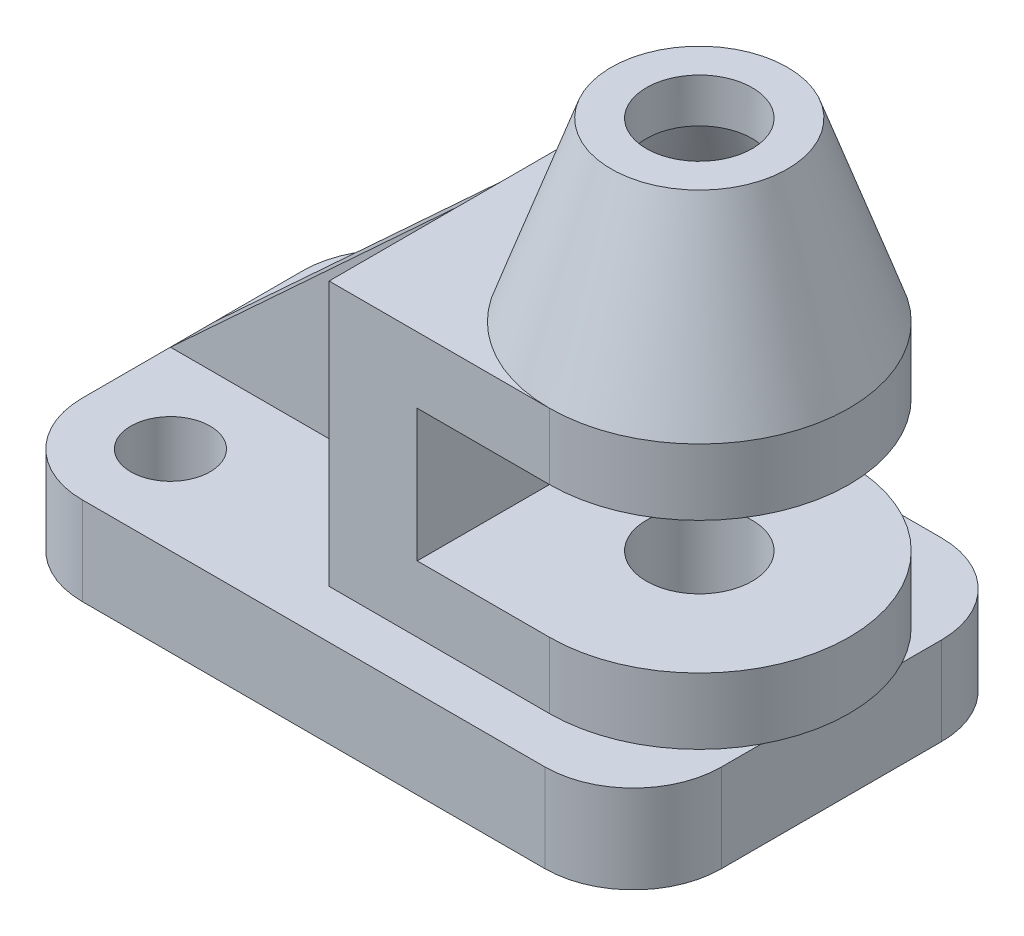
ISO-10303-21;
HEADER;
FILE_DESCRIPTION(('STEP AP214'),'2;1');
FILE_NAME('part.step','',(''),(''),'','','');
FILE_SCHEMA(('AUTOMOTIVE_DESIGN { 1 0 10303 214 1 1 1 1 }'));
ENDSEC;
DATA;
#1=APPLICATION_CONTEXT('core data for automotive mechanical design processes');
#2=APPLICATION_PROTOCOL_DEFINITION('international standard','automotive_design',2000,#1);
#3=PRODUCT_CONTEXT('',#1,'mechanical');
#4=PRODUCT('Part','Part','',(#3));
#5=PRODUCT_RELATED_PRODUCT_CATEGORY('part','',(#4));
#6=PRODUCT_DEFINITION_FORMATION('','',#4);
#7=PRODUCT_DEFINITION_CONTEXT('part definition',#1,'design');
#8=PRODUCT_DEFINITION('design','',#6,#7);
#9=PRODUCT_DEFINITION_SHAPE('','',#8);
#10=(LENGTH_UNIT() NAMED_UNIT(*) SI_UNIT(.MILLI.,.METRE.));
#11=(NAMED_UNIT(*) PLANE_ANGLE_UNIT() SI_UNIT($,.RADIAN.));
#12=(NAMED_UNIT(*) SI_UNIT($,.STERADIAN.) SOLID_ANGLE_UNIT());
#13=UNCERTAINTY_MEASURE_WITH_UNIT(LENGTH_MEASURE(1.E-05),#10,'distance_accuracy_value','');
#14=(GEOMETRIC_REPRESENTATION_CONTEXT(3) GLOBAL_UNCERTAINTY_ASSIGNED_CONTEXT((#13)) GLOBAL_UNIT_ASSIGNED_CONTEXT((#10,
#11,#12)) REPRESENTATION_CONTEXT('',''));
#15=CARTESIAN_POINT('',(0.,0.,0.));
#16=DIRECTION('',(0.,0.,1.));
#17=DIRECTION('',(1.,0.,0.));
#18=AXIS2_PLACEMENT_3D('',#15,#16,#17);
#19=CARTESIAN_POINT('',(42.5,80.,0.));
#20=DIRECTION('',(0.,1.,0.));
#21=DIRECTION('',(0.,0.,1.));
#22=AXIS2_PLACEMENT_3D('',#19,#20,#21);
#23=PLANE('',#22);
#24=DIRECTION('',(1.,0.,0.));
#25=VECTOR('',#24,1.);
#26=CARTESIAN_POINT('',(-7.49999999999997,80.,34.));
#27=LINE('',#26,#25);
#28=CARTESIAN_POINT('',(-7.49999999999997,80.,34.));
#29=VERTEX_POINT('',#28);
#30=CARTESIAN_POINT('',(42.5,80.,34.));
#31=VERTEX_POINT('',#30);
#32=EDGE_CURVE('E198',#29,#31,#27,.T.);
#33=ORIENTED_EDGE('',*,*,#32,.T.);
#34=CARTESIAN_POINT('',(42.5,80.,0.));
#35=DIRECTION('',(0.,1.,0.));
#36=DIRECTION('',(0.,0.,1.));
#37=AXIS2_PLACEMENT_3D('',#34,#35,#36);
#38=CIRCLE('',#37,34.);
#39=CARTESIAN_POINT('',(42.5,80.,-34.));
#40=VERTEX_POINT('',#39);
#41=EDGE_CURVE('E44',#31,#40,#38,.F.);
#42=ORIENTED_EDGE('',*,*,#41,.T.);
#43=DIRECTION('',(-1.,0.,0.));
#44=VECTOR('',#43,1.);
#45=CARTESIAN_POINT('',(42.5,80.,-34.));
#46=LINE('',#45,#44);
#47=CARTESIAN_POINT('',(-7.49999999999998,80.,-34.));
#48=VERTEX_POINT('',#47);
#49=EDGE_CURVE('E175',#40,#48,#46,.T.);
#50=ORIENTED_EDGE('',*,*,#49,.T.);
#51=DIRECTION('',(0.,0.,1.));
#52=VECTOR('',#51,1.);
#53=CARTESIAN_POINT('',(-7.49999999999998,80.,-34.));
#54=LINE('',#53,#52);
#55=CARTESIAN_POINT('',(-7.49999999999997,80.,-5.));
#56=VERTEX_POINT('',#55);
#57=EDGE_CURVE('E206',#48,#56,#54,.T.);
#58=ORIENTED_EDGE('',*,*,#57,.T.);
#59=CARTESIAN_POINT('',(-7.49999999999998,80.,5.));
#60=VERTEX_POINT('',#59);
#61=EDGE_CURVE('E416',#56,#60,#54,.T.);
#62=ORIENTED_EDGE('',*,*,#61,.T.);
#63=EDGE_CURVE('E186',#60,#29,#54,.T.);
#64=ORIENTED_EDGE('',*,*,#63,.T.);
#65=EDGE_LOOP('',(#33,#42,#50,#58,#62,#64));
#66=FACE_BOUND('',#65,.T.);
#67=ADVANCED_FACE('F35',(#66),#23,.T.);
#68=CARTESIAN_POINT('',(0.,20.,0.));
#69=DIRECTION('',(0.,1.,0.));
#70=DIRECTION('',(0.,0.,1.));
#71=AXIS2_PLACEMENT_3D('',#68,#69,#70);
#72=PLANE('',#71);
#73=CARTESIAN_POINT('',(-52.5,20.,-25.));
#74=DIRECTION('',(0.,1.,0.));
#75=DIRECTION('',(0.,0.,1.));
#76=AXIS2_PLACEMENT_3D('',#73,#74,#75);
#77=CIRCLE('',#76,9.);
#78=CARTESIAN_POINT('',(-52.5,20.,-16.));
#79=VERTEX_POINT('',#78);
#80=EDGE_CURVE('E236',#79,#79,#77,.T.);
#81=ORIENTED_EDGE('',*,*,#80,.F.);
#82=EDGE_LOOP('',(#81));
#83=FACE_BOUND('',#82,.T.);
#84=DIRECTION('',(0.,0.,1.));
#85=VECTOR('',#84,1.);
#86=CARTESIAN_POINT('',(-72.5,20.,-45.));
#87=LINE('',#86,#85);
#88=CARTESIAN_POINT('',(-72.5,20.,-25.));
#89=VERTEX_POINT('',#88);
#90=CARTESIAN_POINT('',(-72.5,20.,-5.));
#91=VERTEX_POINT('',#90);
#92=EDGE_CURVE('E251',#89,#91,#87,.T.);
#93=ORIENTED_EDGE('',*,*,#92,.T.);
#94=DIRECTION('',(1.,0.,0.));
#95=VECTOR('',#94,1.);
#96=CARTESIAN_POINT('',(0.,20.,-5.));
#97=LINE('',#96,#95);
#98=CARTESIAN_POINT('',(-7.49999999999998,20.,-5.));
#99=VERTEX_POINT('',#98);
#100=EDGE_CURVE('E386',#91,#99,#97,.T.);
#101=ORIENTED_EDGE('',*,*,#100,.T.);
#102=DIRECTION('',(0.,0.,1.));
#103=VECTOR('',#102,1.);
#104=CARTESIAN_POINT('',(-7.49999999999998,20.,-34.));
#105=LINE('',#104,#103);
#106=CARTESIAN_POINT('',(-7.49999999999998,20.,-34.));
#107=VERTEX_POINT('',#106);
#108=EDGE_CURVE('E214',#107,#99,#105,.T.);
#109=ORIENTED_EDGE('',*,*,#108,.F.);
#110=DIRECTION('',(-1.,0.,0.));
#111=VECTOR('',#110,1.);
#112=CARTESIAN_POINT('',(42.5,20.,-34.));
#113=LINE('',#112,#111);
#114=CARTESIAN_POINT('',(42.5,20.,-34.));
#115=VERTEX_POINT('',#114);
#116=EDGE_CURVE('E210',#115,#107,#113,.T.);
#117=ORIENTED_EDGE('',*,*,#116,.F.);
#118=CARTESIAN_POINT('',(42.5,20.,0.));
#119=DIRECTION('',(0.,1.,0.));
#120=DIRECTION('',(0.,0.,1.));
#121=AXIS2_PLACEMENT_3D('',#118,#119,#120);
#122=CIRCLE('',#121,34.);
#123=CARTESIAN_POINT('',(72.5,20.,-16.0000000000001));
#124=VERTEX_POINT('',#123);
#125=EDGE_CURVE('E201',#124,#115,#122,.T.);
#126=ORIENTED_EDGE('',*,*,#125,.F.);
#127=DIRECTION('',(0.,0.,-1.));
#128=VECTOR('',#127,1.);
#129=CARTESIAN_POINT('',(72.5,20.,-45.));
#130=LINE('',#129,#128);
#131=CARTESIAN_POINT('',(72.5,20.,-25.));
#132=VERTEX_POINT('',#131);
#133=EDGE_CURVE('E247',#124,#132,#130,.T.);
#134=ORIENTED_EDGE('',*,*,#133,.T.);
#135=CARTESIAN_POINT('',(52.5,20.,-25.));
#136=DIRECTION('',(0.,1.,0.));
#137=DIRECTION('',(0.,0.,1.));
#138=AXIS2_PLACEMENT_3D('',#135,#136,#137);
#139=CIRCLE('',#138,20.);
#140=CARTESIAN_POINT('',(52.5,20.,-45.));
#141=VERTEX_POINT('',#140);
#142=EDGE_CURVE('E291',#132,#141,#139,.T.);
#143=ORIENTED_EDGE('',*,*,#142,.T.);
#144=DIRECTION('',(-1.,0.,0.));
#145=VECTOR('',#144,1.);
#146=CARTESIAN_POINT('',(-72.5,20.,-45.));
#147=LINE('',#146,#145);
#148=CARTESIAN_POINT('',(-52.5,20.,-45.));
#149=VERTEX_POINT('',#148);
#150=EDGE_CURVE('E245',#141,#149,#147,.T.);
#151=ORIENTED_EDGE('',*,*,#150,.T.);
#152=CARTESIAN_POINT('',(-52.5,20.,-25.));
#153=DIRECTION('',(0.,1.,0.));
#154=DIRECTION('',(0.,0.,1.));
#155=AXIS2_PLACEMENT_3D('',#152,#153,#154);
#156=CIRCLE('',#155,20.);
#157=EDGE_CURVE('E287',#149,#89,#156,.T.);
#158=ORIENTED_EDGE('',*,*,#157,.T.);
#159=EDGE_LOOP('',(#93,#101,#109,#117,#126,#134,#143,#151,#158));
#160=FACE_BOUND('',#159,.T.);
#161=ADVANCED_FACE('F321',(#83,#160),#72,.T.);
#162=CARTESIAN_POINT('',(-7.49999999999998,80.,-34.));
#163=DIRECTION('',(1.,0.,0.));
#164=DIRECTION('',(0.,0.,-1.));
#165=AXIS2_PLACEMENT_3D('',#162,#163,#164);
#166=PLANE('',#165);
#167=DIRECTION('',(0.,-1.,0.));
#168=VECTOR('',#167,1.);
#169=CARTESIAN_POINT('',(-7.49999999999998,80.,-5.));
#170=LINE('',#169,#168);
#171=EDGE_CURVE('E383',#56,#99,#170,.T.);
#172=ORIENTED_EDGE('',*,*,#171,.F.);
#173=ORIENTED_EDGE('',*,*,#57,.F.);
#174=DIRECTION('',(0.,-1.,0.));
#175=VECTOR('',#174,1.);
#176=CARTESIAN_POINT('',(-7.49999999999998,80.,-34.));
#177=LINE('',#176,#175);
#178=EDGE_CURVE('E182',#48,#107,#177,.T.);
#179=ORIENTED_EDGE('',*,*,#178,.T.);
#180=ORIENTED_EDGE('',*,*,#108,.T.);
#181=EDGE_LOOP('',(#172,#173,#179,#180));
#182=FACE_BOUND('',#181,.T.);
#183=ADVANCED_FACE('F337',(#182),#166,.F.);
#184=CARTESIAN_POINT('',(42.5,80.,-34.));
#185=DIRECTION('',(0.,0.,1.));
#186=DIRECTION('',(1.,0.,0.));
#187=AXIS2_PLACEMENT_3D('',#184,#185,#186);
#188=PLANE('',#187);
#189=DIRECTION('',(-1.,0.,0.));
#190=VECTOR('',#189,1.);
#191=CARTESIAN_POINT('',(0.,35.,-34.));
#192=LINE('',#191,#190);
#193=CARTESIAN_POINT('',(42.5,35.,-34.));
#194=VERTEX_POINT('',#193);
#195=CARTESIAN_POINT('',(12.5,35.,-34.));
#196=VERTEX_POINT('',#195);
#197=EDGE_CURVE('E397',#194,#196,#192,.T.);
#198=ORIENTED_EDGE('',*,*,#197,.F.);
#199=DIRECTION('',(0.,-1.,0.));
#200=VECTOR('',#199,1.);
#201=CARTESIAN_POINT('',(42.5,80.,-34.));
#202=LINE('',#201,#200);
#203=EDGE_CURVE('E195',#194,#115,#202,.T.);
#204=ORIENTED_EDGE('',*,*,#203,.T.);
#205=ORIENTED_EDGE('',*,*,#116,.T.);
#206=ORIENTED_EDGE('',*,*,#178,.F.);
#207=ORIENTED_EDGE('',*,*,#49,.F.);
#208=CARTESIAN_POINT('',(42.5,65.,-34.));
#209=VERTEX_POINT('',#208);
#210=EDGE_CURVE('E179',#40,#209,#202,.T.);
#211=ORIENTED_EDGE('',*,*,#210,.T.);
#212=DIRECTION('',(-1.,0.,0.));
#213=VECTOR('',#212,1.);
#214=CARTESIAN_POINT('',(0.,65.,-34.));
#215=LINE('',#214,#213);
#216=CARTESIAN_POINT('',(12.5,65.,-34.));
#217=VERTEX_POINT('',#216);
#218=EDGE_CURVE('E396',#209,#217,#215,.T.);
#219=ORIENTED_EDGE('',*,*,#218,.T.);
#220=DIRECTION('',(0.,1.,0.));
#221=VECTOR('',#220,1.);
#222=CARTESIAN_POINT('',(12.5,35.,-34.));
#223=LINE('',#222,#221);
#224=EDGE_CURVE('E406',#196,#217,#223,.T.);
#225=ORIENTED_EDGE('',*,*,#224,.F.);
#226=EDGE_LOOP('',(#198,#204,#205,#206,#207,#211,#219,#225));
#227=FACE_BOUND('',#226,.T.);
#228=ADVANCED_FACE('F177',(#227),#188,.F.);
#229=CARTESIAN_POINT('',(-7.49999999999997,80.,34.));
#230=DIRECTION('',(0.,0.,-1.));
#231=DIRECTION('',(-1.,0.,0.));
#232=AXIS2_PLACEMENT_3D('',#229,#230,#231);
#233=PLANE('',#232);
#234=DIRECTION('',(1.,0.,0.));
#235=VECTOR('',#234,1.);
#236=CARTESIAN_POINT('',(0.,35.,34.));
#237=LINE('',#236,#235);
#238=CARTESIAN_POINT('',(12.5,35.,34.));
#239=VERTEX_POINT('',#238);
#240=CARTESIAN_POINT('',(42.5,35.,34.));
#241=VERTEX_POINT('',#240);
#242=EDGE_CURVE('E402',#239,#241,#237,.T.);
#243=ORIENTED_EDGE('',*,*,#242,.F.);
#244=DIRECTION('',(0.,1.,0.));
#245=VECTOR('',#244,1.);
#246=CARTESIAN_POINT('',(12.5,35.,34.));
#247=LINE('',#246,#245);
#248=CARTESIAN_POINT('',(12.5,65.,34.));
#249=VERTEX_POINT('',#248);
#250=EDGE_CURVE('E213',#239,#249,#247,.T.);
#251=ORIENTED_EDGE('',*,*,#250,.T.);
#252=DIRECTION('',(1.,0.,0.));
#253=VECTOR('',#252,1.);
#254=CARTESIAN_POINT('',(0.,65.,34.));
#255=LINE('',#254,#253);
#256=CARTESIAN_POINT('',(42.5,65.,34.));
#257=VERTEX_POINT('',#256);
#258=EDGE_CURVE('E410',#249,#257,#255,.T.);
#259=ORIENTED_EDGE('',*,*,#258,.T.);
#260=DIRECTION('',(0.,-1.,0.));
#261=VECTOR('',#260,1.);
#262=CARTESIAN_POINT('',(42.5,80.,34.));
#263=LINE('',#262,#261);
#264=EDGE_CURVE('E223',#31,#257,#263,.T.);
#265=ORIENTED_EDGE('',*,*,#264,.F.);
#266=ORIENTED_EDGE('',*,*,#32,.F.);
#267=DIRECTION('',(0.,-1.,0.));
#268=VECTOR('',#267,1.);
#269=CARTESIAN_POINT('',(-7.49999999999997,80.,34.));
#270=LINE('',#269,#268);
#271=CARTESIAN_POINT('',(-7.49999999999997,20.,34.));
#272=VERTEX_POINT('',#271);
#273=EDGE_CURVE('E225',#29,#272,#270,.T.);
#274=ORIENTED_EDGE('',*,*,#273,.T.);
#275=DIRECTION('',(1.,0.,0.));
#276=VECTOR('',#275,1.);
#277=CARTESIAN_POINT('',(-7.49999999999997,20.,34.));
#278=LINE('',#277,#276);
#279=CARTESIAN_POINT('',(42.5,20.,34.));
#280=VERTEX_POINT('',#279);
#281=EDGE_CURVE('E217',#272,#280,#278,.T.);
#282=ORIENTED_EDGE('',*,*,#281,.T.);
#283=EDGE_CURVE('E194',#241,#280,#263,.T.);
#284=ORIENTED_EDGE('',*,*,#283,.F.);
#285=EDGE_LOOP('',(#243,#251,#259,#265,#266,#274,#282,#284));
#286=FACE_BOUND('',#285,.T.);
#287=ADVANCED_FACE('F424',(#286),#233,.F.);
#288=CARTESIAN_POINT('',(42.5,80.,0.));
#289=DIRECTION('',(0.,-1.,0.));
#290=DIRECTION('',(0.,0.,-1.));
#291=AXIS2_PLACEMENT_3D('',#288,#289,#290);
#292=CYLINDRICAL_SURFACE('',#291,34.);
#293=CARTESIAN_POINT('',(72.5,20.,16.));
#294=VERTEX_POINT('',#293);
#295=EDGE_CURVE('E220',#294,#124,#122,.T.);
#296=ORIENTED_EDGE('',*,*,#295,.T.);
#297=ORIENTED_EDGE('',*,*,#125,.T.);
#298=ORIENTED_EDGE('',*,*,#203,.F.);
#299=CARTESIAN_POINT('',(42.5,35.,0.));
#300=DIRECTION('',(0.,1.,0.));
#301=DIRECTION('',(0.,0.,1.));
#302=AXIS2_PLACEMENT_3D('',#299,#300,#301);
#303=CIRCLE('',#302,34.);
#304=EDGE_CURVE('E404',#241,#194,#303,.T.);
#305=ORIENTED_EDGE('',*,*,#304,.F.);
#306=ORIENTED_EDGE('',*,*,#283,.T.);
#307=EDGE_CURVE('E187',#280,#294,#122,.T.);
#308=ORIENTED_EDGE('',*,*,#307,.T.);
#309=EDGE_LOOP('',(#296,#297,#298,#305,#306,#308));
#310=FACE_BOUND('',#309,.T.);
#311=ADVANCED_FACE('F315',(#310),#292,.T.);
#312=DIRECTION('',(1.,0.,0.));
#313=VECTOR('',#312,1.);
#314=CARTESIAN_POINT('',(0.,20.,5.));
#315=LINE('',#314,#313);
#316=CARTESIAN_POINT('',(-72.5,20.,5.));
#317=VERTEX_POINT('',#316);
#318=CARTESIAN_POINT('',(-7.49999999999998,20.,5.));
#319=VERTEX_POINT('',#318);
#320=EDGE_CURVE('E392',#317,#319,#315,.T.);
#321=ORIENTED_EDGE('',*,*,#320,.F.);
#322=CARTESIAN_POINT('',(-72.5,20.,25.));
#323=VERTEX_POINT('',#322);
#324=EDGE_CURVE('E250',#317,#323,#87,.T.);
#325=ORIENTED_EDGE('',*,*,#324,.T.);
#326=CARTESIAN_POINT('',(-52.5,20.,25.));
#327=DIRECTION('',(0.,1.,0.));
#328=DIRECTION('',(0.,0.,1.));
#329=AXIS2_PLACEMENT_3D('',#326,#327,#328);
#330=CIRCLE('',#329,20.);
#331=CARTESIAN_POINT('',(-52.5,20.,45.));
#332=VERTEX_POINT('',#331);
#333=EDGE_CURVE('E289',#323,#332,#330,.T.);
#334=ORIENTED_EDGE('',*,*,#333,.T.);
#335=DIRECTION('',(1.,0.,0.));
#336=VECTOR('',#335,1.);
#337=CARTESIAN_POINT('',(-72.5,20.,45.));
#338=LINE('',#337,#336);
#339=CARTESIAN_POINT('',(52.5,20.,45.));
#340=VERTEX_POINT('',#339);
#341=EDGE_CURVE('E254',#332,#340,#338,.T.);
#342=ORIENTED_EDGE('',*,*,#341,.T.);
#343=CARTESIAN_POINT('',(52.5,20.,25.));
#344=DIRECTION('',(0.,1.,0.));
#345=DIRECTION('',(0.,0.,1.));
#346=AXIS2_PLACEMENT_3D('',#343,#344,#345);
#347=CIRCLE('',#346,20.);
#348=CARTESIAN_POINT('',(72.5,20.,25.));
#349=VERTEX_POINT('',#348);
#350=EDGE_CURVE('E293',#340,#349,#347,.T.);
#351=ORIENTED_EDGE('',*,*,#350,.T.);
#352=EDGE_CURVE('E242',#349,#294,#130,.T.);
#353=ORIENTED_EDGE('',*,*,#352,.T.);
#354=ORIENTED_EDGE('',*,*,#307,.F.);
#355=ORIENTED_EDGE('',*,*,#281,.F.);
#356=EDGE_CURVE('E212',#319,#272,#105,.T.);
#357=ORIENTED_EDGE('',*,*,#356,.F.);
#358=EDGE_LOOP('',(#321,#325,#334,#342,#351,#353,#354,#355,#357));
#359=FACE_BOUND('',#358,.T.);
#360=CARTESIAN_POINT('',(-52.5,20.,25.));
#361=DIRECTION('',(0.,1.,0.));
#362=DIRECTION('',(0.,0.,1.));
#363=AXIS2_PLACEMENT_3D('',#360,#361,#362);
#364=CIRCLE('',#363,9.);
#365=CARTESIAN_POINT('',(-52.5,20.,34.));
#366=VERTEX_POINT('',#365);
#367=EDGE_CURVE('E230',#366,#366,#364,.T.);
#368=ORIENTED_EDGE('',*,*,#367,.F.);
#369=EDGE_LOOP('',(#368));
#370=FACE_BOUND('',#369,.T.);
#371=ADVANCED_FACE('F349',(#359,#370),#72,.T.);
#372=CARTESIAN_POINT('',(0.,0.,0.));
#373=DIRECTION('',(0.,1.,0.));
#374=DIRECTION('',(0.,0.,1.));
#375=AXIS2_PLACEMENT_3D('',#372,#373,#374);
#376=PLANE('',#375);
#377=CARTESIAN_POINT('',(42.5,0.,0.));
#378=DIRECTION('',(0.,1.,0.));
#379=DIRECTION('',(0.,0.,1.));
#380=AXIS2_PLACEMENT_3D('',#377,#378,#379);
#381=CIRCLE('',#380,12.);
#382=CARTESIAN_POINT('',(42.5,0.,11.9999999999999));
#383=VERTEX_POINT('',#382);
#384=EDGE_CURVE('E721',#383,#383,#381,.T.);
#385=ORIENTED_EDGE('',*,*,#384,.T.);
#386=EDGE_LOOP('',(#385));
#387=FACE_BOUND('',#386,.T.);
#388=CARTESIAN_POINT('',(-52.5,0.,25.));
#389=DIRECTION('',(0.,1.,0.));
#390=DIRECTION('',(0.,0.,1.));
#391=AXIS2_PLACEMENT_3D('',#388,#389,#390);
#392=CIRCLE('',#391,20.);
#393=CARTESIAN_POINT('',(-52.5,0.,45.));
#394=VERTEX_POINT('',#393);
#395=CARTESIAN_POINT('',(-72.5,0.,25.));
#396=VERTEX_POINT('',#395);
#397=EDGE_CURVE('E274',#394,#396,#392,.F.);
#398=ORIENTED_EDGE('',*,*,#397,.T.);
#399=DIRECTION('',(0.,0.,1.));
#400=VECTOR('',#399,1.);
#401=CARTESIAN_POINT('',(-72.5,0.,-45.));
#402=LINE('',#401,#400);
#403=CARTESIAN_POINT('',(-72.5,0.,-25.));
#404=VERTEX_POINT('',#403);
#405=EDGE_CURVE('E262',#404,#396,#402,.T.);
#406=ORIENTED_EDGE('',*,*,#405,.F.);
#407=CARTESIAN_POINT('',(-52.5,0.,-25.));
#408=DIRECTION('',(0.,1.,0.));
#409=DIRECTION('',(0.,0.,1.));
#410=AXIS2_PLACEMENT_3D('',#407,#408,#409);
#411=CIRCLE('',#410,20.);
#412=CARTESIAN_POINT('',(-52.5,0.,-45.));
#413=VERTEX_POINT('',#412);
#414=EDGE_CURVE('E272',#404,#413,#411,.F.);
#415=ORIENTED_EDGE('',*,*,#414,.T.);
#416=DIRECTION('',(-1.,0.,0.));
#417=VECTOR('',#416,1.);
#418=CARTESIAN_POINT('',(-72.5,0.,-45.));
#419=LINE('',#418,#417);
#420=CARTESIAN_POINT('',(52.5,0.,-45.));
#421=VERTEX_POINT('',#420);
#422=EDGE_CURVE('E259',#421,#413,#419,.T.);
#423=ORIENTED_EDGE('',*,*,#422,.F.);
#424=CARTESIAN_POINT('',(52.5,0.,-25.));
#425=DIRECTION('',(0.,1.,0.));
#426=DIRECTION('',(0.,0.,1.));
#427=AXIS2_PLACEMENT_3D('',#424,#425,#426);
#428=CIRCLE('',#427,20.);
#429=CARTESIAN_POINT('',(72.5,0.,-25.));
#430=VERTEX_POINT('',#429);
#431=EDGE_CURVE('E277',#421,#430,#428,.F.);
#432=ORIENTED_EDGE('',*,*,#431,.T.);
#433=DIRECTION('',(0.,0.,-1.));
#434=VECTOR('',#433,1.);
#435=CARTESIAN_POINT('',(72.5,0.,-45.));
#436=LINE('',#435,#434);
#437=CARTESIAN_POINT('',(72.5,0.,25.));
#438=VERTEX_POINT('',#437);
#439=EDGE_CURVE('E239',#438,#430,#436,.T.);
#440=ORIENTED_EDGE('',*,*,#439,.F.);
#441=CARTESIAN_POINT('',(52.5,0.,25.));
#442=DIRECTION('',(0.,1.,0.));
#443=DIRECTION('',(0.,0.,1.));
#444=AXIS2_PLACEMENT_3D('',#441,#442,#443);
#445=CIRCLE('',#444,20.);
#446=CARTESIAN_POINT('',(52.5,0.,45.));
#447=VERTEX_POINT('',#446);
#448=EDGE_CURVE('E280',#438,#447,#445,.F.);
#449=ORIENTED_EDGE('',*,*,#448,.T.);
#450=DIRECTION('',(1.,0.,0.));
#451=VECTOR('',#450,1.);
#452=CARTESIAN_POINT('',(-72.5,0.,45.));
#453=LINE('',#452,#451);
#454=EDGE_CURVE('E264',#394,#447,#453,.T.);
#455=ORIENTED_EDGE('',*,*,#454,.F.);
#456=EDGE_LOOP('',(#398,#406,#415,#423,#432,#440,#449,#455));
#457=FACE_BOUND('',#456,.T.);
#458=CARTESIAN_POINT('',(-52.5,0.,25.));
#459=DIRECTION('',(0.,1.,0.));
#460=DIRECTION('',(0.,0.,1.));
#461=AXIS2_PLACEMENT_3D('',#458,#459,#460);
#462=CIRCLE('',#461,9.);
#463=CARTESIAN_POINT('',(-52.5,0.,34.));
#464=VERTEX_POINT('',#463);
#465=EDGE_CURVE('E229',#464,#464,#462,.T.);
#466=ORIENTED_EDGE('',*,*,#465,.T.);
#467=EDGE_LOOP('',(#466));
#468=FACE_BOUND('',#467,.T.);
#469=CARTESIAN_POINT('',(-52.5,0.,-25.));
#470=DIRECTION('',(0.,1.,0.));
#471=DIRECTION('',(0.,0.,1.));
#472=AXIS2_PLACEMENT_3D('',#469,#470,#471);
#473=CIRCLE('',#472,9.);
#474=CARTESIAN_POINT('',(-52.5,0.,-16.));
#475=VERTEX_POINT('',#474);
#476=EDGE_CURVE('E233',#475,#475,#473,.T.);
#477=ORIENTED_EDGE('',*,*,#476,.T.);
#478=EDGE_LOOP('',(#477));
#479=FACE_BOUND('',#478,.T.);
#480=ADVANCED_FACE('F448',(#387,#457,#468,#479),#376,.F.);
#481=CARTESIAN_POINT('',(72.5,20.,-45.));
#482=DIRECTION('',(-1.,0.,0.));
#483=DIRECTION('',(0.,0.,1.));
#484=AXIS2_PLACEMENT_3D('',#481,#482,#483);
#485=PLANE('',#484);
#486=ORIENTED_EDGE('',*,*,#439,.T.);
#487=DIRECTION('',(0.,-1.,0.));
#488=VECTOR('',#487,1.);
#489=CARTESIAN_POINT('',(72.5,20.,-25.));
#490=LINE('',#489,#488);
#491=EDGE_CURVE('E257',#430,#132,#490,.F.);
#492=ORIENTED_EDGE('',*,*,#491,.T.);
#493=ORIENTED_EDGE('',*,*,#133,.F.);
#494=EDGE_CURVE('E246',#294,#124,#130,.T.);
#495=ORIENTED_EDGE('',*,*,#494,.F.);
#496=ORIENTED_EDGE('',*,*,#352,.F.);
#497=DIRECTION('',(0.,-1.,0.));
#498=VECTOR('',#497,1.);
#499=CARTESIAN_POINT('',(72.5,20.,25.));
#500=LINE('',#499,#498);
#501=EDGE_CURVE('E269',#349,#438,#500,.T.);
#502=ORIENTED_EDGE('',*,*,#501,.T.);
#503=EDGE_LOOP('',(#486,#492,#493,#495,#496,#502));
#504=FACE_BOUND('',#503,.T.);
#505=ADVANCED_FACE('F323',(#504),#485,.F.);
#506=CARTESIAN_POINT('',(-72.5,20.,-45.));
#507=DIRECTION('',(0.,0.,1.));
#508=DIRECTION('',(1.,0.,0.));
#509=AXIS2_PLACEMENT_3D('',#506,#507,#508);
#510=PLANE('',#509);
#511=ORIENTED_EDGE('',*,*,#150,.F.);
#512=DIRECTION('',(0.,-1.,0.));
#513=VECTOR('',#512,1.);
#514=CARTESIAN_POINT('',(52.5,20.,-45.));
#515=LINE('',#514,#513);
#516=EDGE_CURVE('E297',#141,#421,#515,.T.);
#517=ORIENTED_EDGE('',*,*,#516,.T.);
#518=ORIENTED_EDGE('',*,*,#422,.T.);
#519=DIRECTION('',(0.,-1.,0.));
#520=VECTOR('',#519,1.);
#521=CARTESIAN_POINT('',(-52.5,20.,-45.));
#522=LINE('',#521,#520);
#523=EDGE_CURVE('E295',#413,#149,#522,.F.);
#524=ORIENTED_EDGE('',*,*,#523,.T.);
#525=EDGE_LOOP('',(#511,#517,#518,#524));
#526=FACE_BOUND('',#525,.T.);
#527=ADVANCED_FACE('F465',(#526),#510,.F.);
#528=CARTESIAN_POINT('',(-72.5,20.,-45.));
#529=DIRECTION('',(1.,0.,0.));
#530=DIRECTION('',(0.,0.,-1.));
#531=AXIS2_PLACEMENT_3D('',#528,#529,#530);
#532=PLANE('',#531);
#533=ORIENTED_EDGE('',*,*,#324,.F.);
#534=DIRECTION('',(0.,0.,1.));
#535=VECTOR('',#534,1.);
#536=CARTESIAN_POINT('',(-72.5,20.,-45.));
#537=LINE('',#536,#535);
#538=EDGE_CURVE('E394',#91,#317,#537,.T.);
#539=ORIENTED_EDGE('',*,*,#538,.F.);
#540=ORIENTED_EDGE('',*,*,#92,.F.);
#541=DIRECTION('',(0.,-1.,0.));
#542=VECTOR('',#541,1.);
#543=CARTESIAN_POINT('',(-72.5,20.,-25.));
#544=LINE('',#543,#542);
#545=EDGE_CURVE('E300',#89,#404,#544,.T.);
#546=ORIENTED_EDGE('',*,*,#545,.T.);
#547=ORIENTED_EDGE('',*,*,#405,.T.);
#548=DIRECTION('',(0.,-1.,0.));
#549=VECTOR('',#548,1.);
#550=CARTESIAN_POINT('',(-72.5,20.,25.));
#551=LINE('',#550,#549);
#552=EDGE_CURVE('E303',#396,#323,#551,.F.);
#553=ORIENTED_EDGE('',*,*,#552,.T.);
#554=EDGE_LOOP('',(#533,#539,#540,#546,#547,#553));
#555=FACE_BOUND('',#554,.T.);
#556=ADVANCED_FACE('F457',(#555),#532,.F.);
#557=CARTESIAN_POINT('',(-72.5,20.,45.));
#558=DIRECTION('',(0.,0.,-1.));
#559=DIRECTION('',(-1.,0.,0.));
#560=AXIS2_PLACEMENT_3D('',#557,#558,#559);
#561=PLANE('',#560);
#562=ORIENTED_EDGE('',*,*,#454,.T.);
#563=DIRECTION('',(0.,-1.,0.));
#564=VECTOR('',#563,1.);
#565=CARTESIAN_POINT('',(52.5,20.,45.));
#566=LINE('',#565,#564);
#567=EDGE_CURVE('E285',#447,#340,#566,.F.);
#568=ORIENTED_EDGE('',*,*,#567,.T.);
#569=ORIENTED_EDGE('',*,*,#341,.F.);
#570=DIRECTION('',(0.,-1.,0.));
#571=VECTOR('',#570,1.);
#572=CARTESIAN_POINT('',(-52.5,20.,45.));
#573=LINE('',#572,#571);
#574=EDGE_CURVE('E282',#332,#394,#573,.T.);
#575=ORIENTED_EDGE('',*,*,#574,.T.);
#576=EDGE_LOOP('',(#562,#568,#569,#575));
#577=FACE_BOUND('',#576,.T.);
#578=ADVANCED_FACE('F451',(#577),#561,.F.);
#579=CARTESIAN_POINT('',(-52.5,20.,-25.));
#580=DIRECTION('',(0.,-1.,0.));
#581=DIRECTION('',(0.,0.,-1.));
#582=AXIS2_PLACEMENT_3D('',#579,#580,#581);
#583=CYLINDRICAL_SURFACE('',#582,9.);
#584=ORIENTED_EDGE('',*,*,#80,.T.);
#585=EDGE_LOOP('',(#584));
#586=FACE_BOUND('',#585,.T.);
#587=ORIENTED_EDGE('',*,*,#476,.F.);
#588=EDGE_LOOP('',(#587));
#589=FACE_BOUND('',#588,.T.);
#590=ADVANCED_FACE('F486',(#586,#589),#583,.F.);
#591=CARTESIAN_POINT('',(-52.5,20.,25.));
#592=DIRECTION('',(0.,-1.,0.));
#593=DIRECTION('',(0.,0.,-1.));
#594=AXIS2_PLACEMENT_3D('',#591,#592,#593);
#595=CYLINDRICAL_SURFACE('',#594,9.);
#596=ORIENTED_EDGE('',*,*,#367,.T.);
#597=EDGE_LOOP('',(#596));
#598=FACE_BOUND('',#597,.T.);
#599=ORIENTED_EDGE('',*,*,#465,.F.);
#600=EDGE_LOOP('',(#599));
#601=FACE_BOUND('',#600,.T.);
#602=ADVANCED_FACE('F475',(#598,#601),#595,.F.);
#603=CARTESIAN_POINT('',(52.5,20.,25.));
#604=DIRECTION('',(0.,-1.,0.));
#605=DIRECTION('',(0.,0.,-1.));
#606=AXIS2_PLACEMENT_3D('',#603,#604,#605);
#607=CYLINDRICAL_SURFACE('',#606,20.);
#608=ORIENTED_EDGE('',*,*,#350,.F.);
#609=ORIENTED_EDGE('',*,*,#567,.F.);
#610=ORIENTED_EDGE('',*,*,#448,.F.);
#611=ORIENTED_EDGE('',*,*,#501,.F.);
#612=EDGE_LOOP('',(#608,#609,#610,#611));
#613=FACE_BOUND('',#612,.T.);
#614=ADVANCED_FACE('F444',(#613),#607,.T.);
#615=CARTESIAN_POINT('',(52.5,20.,-25.));
#616=DIRECTION('',(0.,-1.,0.));
#617=DIRECTION('',(0.,0.,-1.));
#618=AXIS2_PLACEMENT_3D('',#615,#616,#617);
#619=CYLINDRICAL_SURFACE('',#618,20.);
#620=ORIENTED_EDGE('',*,*,#142,.F.);
#621=ORIENTED_EDGE('',*,*,#491,.F.);
#622=ORIENTED_EDGE('',*,*,#431,.F.);
#623=ORIENTED_EDGE('',*,*,#516,.F.);
#624=EDGE_LOOP('',(#620,#621,#622,#623));
#625=FACE_BOUND('',#624,.T.);
#626=ADVANCED_FACE('F468',(#625),#619,.T.);
#627=CARTESIAN_POINT('',(-52.5,20.,25.));
#628=DIRECTION('',(0.,-1.,0.));
#629=DIRECTION('',(0.,0.,-1.));
#630=AXIS2_PLACEMENT_3D('',#627,#628,#629);
#631=CYLINDRICAL_SURFACE('',#630,20.);
#632=ORIENTED_EDGE('',*,*,#333,.F.);
#633=ORIENTED_EDGE('',*,*,#552,.F.);
#634=ORIENTED_EDGE('',*,*,#397,.F.);
#635=ORIENTED_EDGE('',*,*,#574,.F.);
#636=EDGE_LOOP('',(#632,#633,#634,#635));
#637=FACE_BOUND('',#636,.T.);
#638=ADVANCED_FACE('F338',(#637),#631,.T.);
#639=CARTESIAN_POINT('',(-52.5,20.,-25.));
#640=DIRECTION('',(0.,-1.,0.));
#641=DIRECTION('',(0.,0.,-1.));
#642=AXIS2_PLACEMENT_3D('',#639,#640,#641);
#643=CYLINDRICAL_SURFACE('',#642,20.);
#644=ORIENTED_EDGE('',*,*,#157,.F.);
#645=ORIENTED_EDGE('',*,*,#523,.F.);
#646=ORIENTED_EDGE('',*,*,#414,.F.);
#647=ORIENTED_EDGE('',*,*,#545,.F.);
#648=EDGE_LOOP('',(#644,#645,#646,#647));
#649=FACE_BOUND('',#648,.T.);
#650=ADVANCED_FACE('F37',(#649),#643,.T.);
#651=CARTESIAN_POINT('',(42.5,20.,0.));
#652=DIRECTION('',(0.,1.,0.));
#653=DIRECTION('',(0.,0.,1.));
#654=AXIS2_PLACEMENT_3D('',#651,#652,#653);
#655=PLANE('',#654);
#656=ORIENTED_EDGE('',*,*,#494,.T.);
#657=ORIENTED_EDGE('',*,*,#295,.F.);
#658=EDGE_LOOP('',(#656,#657));
#659=FACE_BOUND('',#658,.T.);
#660=ADVANCED_FACE('F327',(#659),#655,.F.);
#661=ORIENTED_EDGE('',*,*,#63,.F.);
#662=DIRECTION('',(0.,-1.,0.));
#663=VECTOR('',#662,1.);
#664=CARTESIAN_POINT('',(-7.49999999999998,80.,5.));
#665=LINE('',#664,#663);
#666=EDGE_CURVE('E389',#60,#319,#665,.T.);
#667=ORIENTED_EDGE('',*,*,#666,.T.);
#668=ORIENTED_EDGE('',*,*,#356,.T.);
#669=ORIENTED_EDGE('',*,*,#273,.F.);
#670=EDGE_LOOP('',(#661,#667,#668,#669));
#671=FACE_BOUND('',#670,.T.);
#672=ADVANCED_FACE('F329',(#671),#166,.F.);
#673=CARTESIAN_POINT('',(42.5,65.,0.));
#674=DIRECTION('',(0.,1.,0.));
#675=DIRECTION('',(0.,0.,1.));
#676=AXIS2_PLACEMENT_3D('',#673,#674,#675);
#677=CIRCLE('',#676,34.);
#678=EDGE_CURVE('E59',#257,#209,#677,.T.);
#679=ORIENTED_EDGE('',*,*,#678,.T.);
#680=ORIENTED_EDGE('',*,*,#210,.F.);
#681=CARTESIAN_POINT('',(42.5,80.,0.));
#682=DIRECTION('',(0.,1.,0.));
#683=DIRECTION('',(0.,0.,1.));
#684=AXIS2_PLACEMENT_3D('',#681,#682,#683);
#685=CIRCLE('',#684,34.);
#686=EDGE_CURVE('E192',#31,#40,#685,.T.);
#687=ORIENTED_EDGE('',*,*,#686,.F.);
#688=ORIENTED_EDGE('',*,*,#264,.T.);
#689=EDGE_LOOP('',(#679,#680,#687,#688));
#690=FACE_BOUND('',#689,.T.);
#691=ADVANCED_FACE('F190',(#690),#292,.T.);
#692=CARTESIAN_POINT('',(12.5,35.,0.));
#693=DIRECTION('',(-1.,0.,0.));
#694=DIRECTION('',(0.,0.,1.));
#695=AXIS2_PLACEMENT_3D('',#692,#693,#694);
#696=PLANE('',#695);
#697=ORIENTED_EDGE('',*,*,#250,.F.);
#698=DIRECTION('',(0.,0.,1.));
#699=VECTOR('',#698,1.);
#700=CARTESIAN_POINT('',(12.5,35.,0.));
#701=LINE('',#700,#699);
#702=EDGE_CURVE('E400',#196,#239,#701,.T.);
#703=ORIENTED_EDGE('',*,*,#702,.F.);
#704=ORIENTED_EDGE('',*,*,#224,.T.);
#705=DIRECTION('',(0.,0.,1.));
#706=VECTOR('',#705,1.);
#707=CARTESIAN_POINT('',(12.5,65.,0.));
#708=LINE('',#707,#706);
#709=EDGE_CURVE('E408',#217,#249,#708,.T.);
#710=ORIENTED_EDGE('',*,*,#709,.T.);
#711=EDGE_LOOP('',(#697,#703,#704,#710));
#712=FACE_BOUND('',#711,.T.);
#713=ADVANCED_FACE('F432',(#712),#696,.F.);
#714=CARTESIAN_POINT('',(0.,35.,0.));
#715=DIRECTION('',(0.,1.,0.));
#716=DIRECTION('',(0.,0.,1.));
#717=AXIS2_PLACEMENT_3D('',#714,#715,#716);
#718=PLANE('',#717);
#719=CARTESIAN_POINT('',(42.5,35.,0.));
#720=DIRECTION('',(0.,1.,0.));
#721=DIRECTION('',(0.,0.,1.));
#722=AXIS2_PLACEMENT_3D('',#719,#720,#721);
#723=CIRCLE('',#722,12.);
#724=CARTESIAN_POINT('',(42.5,35.,12.));
#725=VERTEX_POINT('',#724);
#726=EDGE_CURVE('E379',#725,#725,#723,.T.);
#727=ORIENTED_EDGE('',*,*,#726,.F.);
#728=EDGE_LOOP('',(#727));
#729=FACE_BOUND('',#728,.T.);
#730=ORIENTED_EDGE('',*,*,#304,.T.);
#731=ORIENTED_EDGE('',*,*,#197,.T.);
#732=ORIENTED_EDGE('',*,*,#702,.T.);
#733=ORIENTED_EDGE('',*,*,#242,.T.);
#734=EDGE_LOOP('',(#730,#731,#732,#733));
#735=FACE_BOUND('',#734,.T.);
#736=ADVANCED_FACE('F434',(#729,#735),#718,.T.);
#737=CARTESIAN_POINT('',(0.,65.,0.));
#738=DIRECTION('',(0.,1.,0.));
#739=DIRECTION('',(0.,0.,1.));
#740=AXIS2_PLACEMENT_3D('',#737,#738,#739);
#741=PLANE('',#740);
#742=CARTESIAN_POINT('',(42.5,65.,0.));
#743=DIRECTION('',(0.,1.,0.));
#744=DIRECTION('',(0.,0.,1.));
#745=AXIS2_PLACEMENT_3D('',#742,#743,#744);
#746=CIRCLE('',#745,12.);
#747=CARTESIAN_POINT('',(42.5,65.,12.));
#748=VERTEX_POINT('',#747);
#749=EDGE_CURVE('E729',#748,#748,#746,.T.);
#750=ORIENTED_EDGE('',*,*,#749,.T.);
#751=EDGE_LOOP('',(#750));
#752=FACE_BOUND('',#751,.T.);
#753=ORIENTED_EDGE('',*,*,#258,.F.);
#754=ORIENTED_EDGE('',*,*,#709,.F.);
#755=ORIENTED_EDGE('',*,*,#218,.F.);
#756=ORIENTED_EDGE('',*,*,#678,.F.);
#757=EDGE_LOOP('',(#753,#754,#755,#756));
#758=FACE_BOUND('',#757,.T.);
#759=ADVANCED_FACE('F429',(#752,#758),#741,.F.);
#760=CARTESIAN_POINT('',(-7.49999999999997,80.,0.));
#761=DIRECTION('',(-0.678280102733066,0.734803444627488,0.));
#762=DIRECTION('',(-0.734803444627488,-0.678280102733066,0.));
#763=AXIS2_PLACEMENT_3D('',#760,#761,#762);
#764=PLANE('',#763);
#765=DIRECTION('',(-0.734803444627488,-0.678280102733066,0.));
#766=VECTOR('',#765,1.);
#767=CARTESIAN_POINT('',(-7.49999999999997,80.,-5.));
#768=LINE('',#767,#766);
#769=EDGE_CURVE('E373',#56,#91,#768,.T.);
#770=ORIENTED_EDGE('',*,*,#769,.T.);
#771=ORIENTED_EDGE('',*,*,#538,.T.);
#772=DIRECTION('',(-0.734803444627488,-0.678280102733066,0.));
#773=VECTOR('',#772,1.);
#774=CARTESIAN_POINT('',(-7.49999999999997,80.,5.));
#775=LINE('',#774,#773);
#776=EDGE_CURVE('E51',#60,#317,#775,.T.);
#777=ORIENTED_EDGE('',*,*,#776,.F.);
#778=ORIENTED_EDGE('',*,*,#61,.F.);
#779=EDGE_LOOP('',(#770,#771,#777,#778));
#780=FACE_BOUND('',#779,.T.);
#781=ADVANCED_FACE('F597',(#780),#764,.T.);
#782=CARTESIAN_POINT('',(2.00000000000002,40.,5.));
#783=DIRECTION('',(0.,0.,1.));
#784=DIRECTION('',(1.,0.,0.));
#785=AXIS2_PLACEMENT_3D('',#782,#783,#784);
#786=PLANE('',#785);
#787=ORIENTED_EDGE('',*,*,#776,.T.);
#788=ORIENTED_EDGE('',*,*,#320,.T.);
#789=ORIENTED_EDGE('',*,*,#666,.F.);
#790=EDGE_LOOP('',(#787,#788,#789));
#791=FACE_BOUND('',#790,.T.);
#792=ADVANCED_FACE('F620',(#791),#786,.T.);
#793=CARTESIAN_POINT('',(2.00000000000002,40.,-5.));
#794=DIRECTION('',(0.,0.,1.));
#795=DIRECTION('',(1.,0.,0.));
#796=AXIS2_PLACEMENT_3D('',#793,#794,#795);
#797=PLANE('',#796);
#798=ORIENTED_EDGE('',*,*,#100,.F.);
#799=ORIENTED_EDGE('',*,*,#769,.F.);
#800=ORIENTED_EDGE('',*,*,#171,.T.);
#801=EDGE_LOOP('',(#798,#799,#800));
#802=FACE_BOUND('',#801,.T.);
#803=ADVANCED_FACE('F629',(#802),#797,.F.);
#804=CARTESIAN_POINT('',(42.5,120.,0.));
#805=DIRECTION('',(0.,-1.,0.));
#806=DIRECTION('',(0.,0.,-1.));
#807=AXIS2_PLACEMENT_3D('',#804,#805,#806);
#808=PLANE('',#807);
#809=CARTESIAN_POINT('',(42.5,120.,0.));
#810=DIRECTION('',(0.,1.,0.));
#811=DIRECTION('',(0.,0.,1.));
#812=AXIS2_PLACEMENT_3D('',#809,#810,#811);
#813=CIRCLE('',#812,12.);
#814=CARTESIAN_POINT('',(42.5,120.,12.));
#815=VERTEX_POINT('',#814);
#816=EDGE_CURVE('E718',#815,#815,#813,.T.);
#817=ORIENTED_EDGE('',*,*,#816,.F.);
#818=EDGE_LOOP('',(#817));
#819=FACE_BOUND('',#818,.T.);
#820=CARTESIAN_POINT('',(42.5,120.,0.));
#821=DIRECTION('',(0.,-1.,0.));
#822=DIRECTION('',(0.,0.,-1.));
#823=AXIS2_PLACEMENT_3D('',#820,#821,#822);
#824=CIRCLE('',#823,20.);
#825=CARTESIAN_POINT('',(42.5,120.,-20.));
#826=VERTEX_POINT('',#825);
#827=EDGE_CURVE('E374',#826,#826,#824,.T.);
#828=ORIENTED_EDGE('',*,*,#827,.F.);
#829=EDGE_LOOP('',(#828));
#830=FACE_BOUND('',#829,.T.);
#831=ADVANCED_FACE('F638',(#819,#830),#808,.F.);
#832=CARTESIAN_POINT('',(42.5,120.,0.));
#833=DIRECTION('',(0.,-1.,0.));
#834=DIRECTION('',(0.,0.,-1.));
#835=AXIS2_PLACEMENT_3D('',#832,#833,#834);
#836=CONICAL_SURFACE('',#835,20.,0.336674819386727);
#837=ORIENTED_EDGE('',*,*,#686,.T.);
#838=ORIENTED_EDGE('',*,*,#41,.F.);
#839=EDGE_LOOP('',(#837,#838));
#840=FACE_BOUND('',#839,.T.);
#841=ORIENTED_EDGE('',*,*,#827,.T.);
#842=EDGE_LOOP('',(#841));
#843=FACE_BOUND('',#842,.T.);
#844=ADVANCED_FACE('F203',(#840,#843),#836,.T.);
#845=CARTESIAN_POINT('',(42.5,0.,0.));
#846=DIRECTION('',(0.,1.,0.));
#847=DIRECTION('',(0.,0.,1.));
#848=AXIS2_PLACEMENT_3D('',#845,#846,#847);
#849=CYLINDRICAL_SURFACE('',#848,12.);
#850=CARTESIAN_POINT('',(42.5,80.,0.));
#851=DIRECTION('',(0.,1.,0.));
#852=DIRECTION('',(0.,0.,1.));
#853=AXIS2_PLACEMENT_3D('',#850,#851,#852);
#854=CIRCLE('',#853,12.);
#855=CARTESIAN_POINT('',(42.5,80.,12.));
#856=VERTEX_POINT('',#855);
#857=EDGE_CURVE('E39',#856,#856,#854,.T.);
#858=ORIENTED_EDGE('',*,*,#857,.T.);
#859=EDGE_LOOP('',(#858));
#860=FACE_BOUND('',#859,.T.);
#861=ORIENTED_EDGE('',*,*,#749,.F.);
#862=EDGE_LOOP('',(#861));
#863=FACE_BOUND('',#862,.T.);
#864=ADVANCED_FACE('F662',(#860,#863),#849,.F.);
#865=CARTESIAN_POINT('',(42.5,110.,0.));
#866=DIRECTION('',(0.,-1.,0.));
#867=DIRECTION('',(0.,0.,-1.));
#868=AXIS2_PLACEMENT_3D('',#865,#866,#867);
#869=CIRCLE('',#868,12.);
#870=CARTESIAN_POINT('',(42.5,110.,-12.));
#871=VERTEX_POINT('',#870);
#872=EDGE_CURVE('E726',#871,#871,#869,.T.);
#873=ORIENTED_EDGE('',*,*,#872,.T.);
#874=EDGE_LOOP('',(#873));
#875=FACE_BOUND('',#874,.T.);
#876=ORIENTED_EDGE('',*,*,#816,.T.);
#877=EDGE_LOOP('',(#876));
#878=FACE_BOUND('',#877,.T.);
#879=ADVANCED_FACE('F692',(#875,#878),#849,.F.);
#880=ORIENTED_EDGE('',*,*,#726,.T.);
#881=EDGE_LOOP('',(#880));
#882=FACE_BOUND('',#881,.T.);
#883=ORIENTED_EDGE('',*,*,#384,.F.);
#884=EDGE_LOOP('',(#883));
#885=FACE_BOUND('',#884,.T.);
#886=ADVANCED_FACE('F367',(#882,#885),#849,.F.);
#887=CARTESIAN_POINT('',(42.5,110.,0.));
#888=DIRECTION('',(0.,-1.,0.));
#889=DIRECTION('',(0.,0.,-1.));
#890=AXIS2_PLACEMENT_3D('',#887,#888,#889);
#891=CONICAL_SURFACE('',#890,12.9051899497915,0.336674819386727);
#892=CARTESIAN_POINT('',(42.5,80.,0.));
#893=DIRECTION('',(0.,1.,0.));
#894=DIRECTION('',(0.,0.,1.));
#895=AXIS2_PLACEMENT_3D('',#892,#893,#894);
#896=CIRCLE('',#895,23.4051899497915);
#897=CARTESIAN_POINT('',(42.5,80.,23.4051899497915));
#898=VERTEX_POINT('',#897);
#899=EDGE_CURVE('E11',#898,#898,#896,.F.);
#900=ORIENTED_EDGE('',*,*,#899,.T.);
#901=EDGE_LOOP('',(#900));
#902=FACE_BOUND('',#901,.T.);
#903=CARTESIAN_POINT('',(42.5,110.,0.));
#904=DIRECTION('',(0.,-1.,0.));
#905=DIRECTION('',(0.,0.,-1.));
#906=AXIS2_PLACEMENT_3D('',#903,#904,#905);
#907=CIRCLE('',#906,12.9051899497915);
#908=CARTESIAN_POINT('',(42.5,110.,-12.9051899497915));
#909=VERTEX_POINT('',#908);
#910=EDGE_CURVE('E371',#909,#909,#907,.T.);
#911=ORIENTED_EDGE('',*,*,#910,.F.);
#912=EDGE_LOOP('',(#911));
#913=FACE_BOUND('',#912,.T.);
#914=ADVANCED_FACE('F357',(#902,#913),#891,.F.);
#915=CARTESIAN_POINT('',(42.5,110.,0.));
#916=DIRECTION('',(0.,-1.,0.));
#917=DIRECTION('',(0.,0.,-1.));
#918=AXIS2_PLACEMENT_3D('',#915,#916,#917);
#919=PLANE('',#918);
#920=ORIENTED_EDGE('',*,*,#872,.F.);
#921=EDGE_LOOP('',(#920));
#922=FACE_BOUND('',#921,.T.);
#923=ORIENTED_EDGE('',*,*,#910,.T.);
#924=EDGE_LOOP('',(#923));
#925=FACE_BOUND('',#924,.T.);
#926=ADVANCED_FACE('F352',(#922,#925),#919,.T.);
#927=ORIENTED_EDGE('',*,*,#857,.F.);
#928=EDGE_LOOP('',(#927));
#929=FACE_BOUND('',#928,.T.);
#930=ORIENTED_EDGE('',*,*,#899,.F.);
#931=EDGE_LOOP('',(#930));
#932=FACE_BOUND('',#931,.T.);
#933=ADVANCED_FACE('F343',(#929,#932),#23,.T.);
#934=CLOSED_SHELL('',(#67,#161,#183,#228,#287,#311,#371,#480,#505,#527,#556,#578,#590,#602,#614,
#626,#638,#650,#660,#672,#691,#713,#736,#759,#781,#792,#803,#831,#844,#864,#879,#886,#914,#926,#933));
#935=MANIFOLD_SOLID_BREP('B2',#934);
#936=ADVANCED_BREP_SHAPE_REPRESENTATION('',(#18,#935),#14);
#937=SHAPE_DEFINITION_REPRESENTATION(#9,#936);
ENDSEC;
END-ISO-10303-21;
